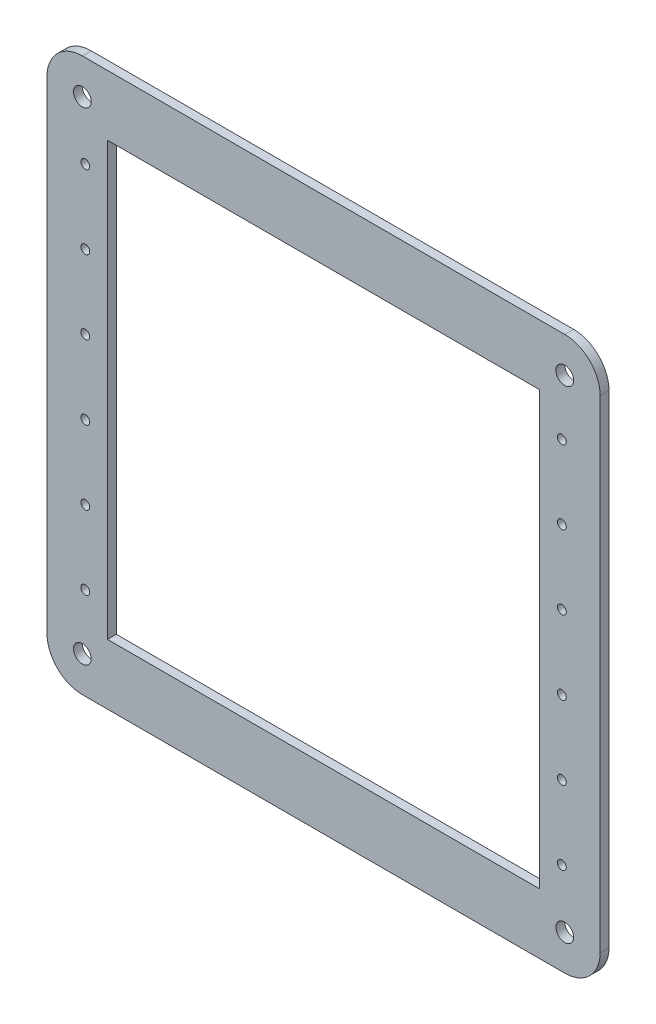
ISO-10303-21;
HEADER;
FILE_DESCRIPTION(('STEP AP214'),'2;1');
FILE_NAME('part.step','',(''),(''),'','','');
FILE_SCHEMA(('AUTOMOTIVE_DESIGN { 1 0 10303 214 1 1 1 1 }'));
ENDSEC;
DATA;
#1=APPLICATION_CONTEXT('core data for automotive mechanical design processes');
#2=APPLICATION_PROTOCOL_DEFINITION('international standard','automotive_design',2000,#1);
#3=PRODUCT_CONTEXT('',#1,'mechanical');
#4=PRODUCT('Part','Part','',(#3));
#5=PRODUCT_RELATED_PRODUCT_CATEGORY('part','',(#4));
#6=PRODUCT_DEFINITION_FORMATION('','',#4);
#7=PRODUCT_DEFINITION_CONTEXT('part definition',#1,'design');
#8=PRODUCT_DEFINITION('design','',#6,#7);
#9=PRODUCT_DEFINITION_SHAPE('','',#8);
#10=(LENGTH_UNIT() NAMED_UNIT(*) SI_UNIT(.MILLI.,.METRE.));
#11=(NAMED_UNIT(*) PLANE_ANGLE_UNIT() SI_UNIT($,.RADIAN.));
#12=(NAMED_UNIT(*) SI_UNIT($,.STERADIAN.) SOLID_ANGLE_UNIT());
#13=UNCERTAINTY_MEASURE_WITH_UNIT(LENGTH_MEASURE(1.E-05),#10,'distance_accuracy_value','');
#14=(GEOMETRIC_REPRESENTATION_CONTEXT(3) GLOBAL_UNCERTAINTY_ASSIGNED_CONTEXT((#13)) GLOBAL_UNIT_ASSIGNED_CONTEXT((#10,
#11,#12)) REPRESENTATION_CONTEXT('',''));
#15=CARTESIAN_POINT('',(0.,0.,0.));
#16=DIRECTION('',(0.,0.,1.));
#17=DIRECTION('',(1.,0.,0.));
#18=AXIS2_PLACEMENT_3D('',#15,#16,#17);
#19=CARTESIAN_POINT('',(-109.,-109.,4.));
#20=DIRECTION('',(0.,0.,1.));
#21=DIRECTION('',(1.,0.,0.));
#22=AXIS2_PLACEMENT_3D('',#19,#20,#21);
#23=PLANE('',#22);
#24=CARTESIAN_POINT('',(107.686291501015,-16.7000000000003,4.));
#25=DIRECTION('',(0.,0.,1.));
#26=DIRECTION('',(1.,0.,0.));
#27=AXIS2_PLACEMENT_3D('',#24,#25,#26);
#28=CIRCLE('',#27,2.);
#29=CARTESIAN_POINT('',(109.686291501015,-16.7000000000003,4.));
#30=VERTEX_POINT('',#29);
#31=EDGE_CURVE('E612',#30,#30,#28,.T.);
#32=ORIENTED_EDGE('',*,*,#31,.F.);
#33=EDGE_LOOP('',(#32));
#34=FACE_BOUND('',#33,.T.);
#35=CARTESIAN_POINT('',(107.686291501015,-50.0000000000003,4.));
#36=DIRECTION('',(0.,0.,1.));
#37=DIRECTION('',(1.,0.,0.));
#38=AXIS2_PLACEMENT_3D('',#35,#36,#37);
#39=CIRCLE('',#38,2.);
#40=CARTESIAN_POINT('',(109.686291501015,-50.0000000000003,4.));
#41=VERTEX_POINT('',#40);
#42=EDGE_CURVE('E613',#41,#41,#39,.T.);
#43=ORIENTED_EDGE('',*,*,#42,.F.);
#44=EDGE_LOOP('',(#43));
#45=FACE_BOUND('',#44,.T.);
#46=CARTESIAN_POINT('',(107.686291501015,-83.3000000000003,4.));
#47=DIRECTION('',(0.,0.,1.));
#48=DIRECTION('',(1.,0.,0.));
#49=AXIS2_PLACEMENT_3D('',#46,#47,#48);
#50=CIRCLE('',#49,2.00000000000001);
#51=CARTESIAN_POINT('',(109.686291501015,-83.3000000000003,4.));
#52=VERTEX_POINT('',#51);
#53=EDGE_CURVE('E617',#52,#52,#50,.T.);
#54=ORIENTED_EDGE('',*,*,#53,.F.);
#55=EDGE_LOOP('',(#54));
#56=FACE_BOUND('',#55,.T.);
#57=CARTESIAN_POINT('',(-107.686291501015,-83.3000000000003,4.));
#58=DIRECTION('',(0.,0.,1.));
#59=DIRECTION('',(1.,0.,0.));
#60=AXIS2_PLACEMENT_3D('',#57,#58,#59);
#61=CIRCLE('',#60,2.);
#62=CARTESIAN_POINT('',(-105.686291501015,-83.3000000000003,4.));
#63=VERTEX_POINT('',#62);
#64=EDGE_CURVE('E635',#63,#63,#61,.T.);
#65=ORIENTED_EDGE('',*,*,#64,.F.);
#66=EDGE_LOOP('',(#65));
#67=FACE_BOUND('',#66,.T.);
#68=CARTESIAN_POINT('',(-107.686291501015,-50.0000000000003,4.));
#69=DIRECTION('',(0.,0.,1.));
#70=DIRECTION('',(1.,0.,0.));
#71=AXIS2_PLACEMENT_3D('',#68,#69,#70);
#72=CIRCLE('',#71,2.00000000000001);
#73=CARTESIAN_POINT('',(-105.686291501015,-50.0000000000003,4.));
#74=VERTEX_POINT('',#73);
#75=EDGE_CURVE('E633',#74,#74,#72,.T.);
#76=ORIENTED_EDGE('',*,*,#75,.F.);
#77=EDGE_LOOP('',(#76));
#78=FACE_BOUND('',#77,.T.);
#79=CARTESIAN_POINT('',(-107.686291501015,-16.7000000000003,4.));
#80=DIRECTION('',(0.,0.,1.));
#81=DIRECTION('',(1.,0.,0.));
#82=AXIS2_PLACEMENT_3D('',#79,#80,#81);
#83=CIRCLE('',#82,2.);
#84=CARTESIAN_POINT('',(-105.686291501015,-16.7000000000003,4.));
#85=VERTEX_POINT('',#84);
#86=EDGE_CURVE('E630',#85,#85,#83,.T.);
#87=ORIENTED_EDGE('',*,*,#86,.F.);
#88=EDGE_LOOP('',(#87));
#89=FACE_BOUND('',#88,.T.);
#90=CARTESIAN_POINT('',(-107.686291501015,16.7000000000004,4.));
#91=DIRECTION('',(0.,0.,1.));
#92=DIRECTION('',(1.,0.,0.));
#93=AXIS2_PLACEMENT_3D('',#90,#91,#92);
#94=CIRCLE('',#93,2.00000000000001);
#95=CARTESIAN_POINT('',(-105.686291501015,16.7000000000004,4.));
#96=VERTEX_POINT('',#95);
#97=EDGE_CURVE('E627',#96,#96,#94,.T.);
#98=ORIENTED_EDGE('',*,*,#97,.F.);
#99=EDGE_LOOP('',(#98));
#100=FACE_BOUND('',#99,.T.);
#101=CARTESIAN_POINT('',(-107.686291501015,50.0000000000004,4.));
#102=DIRECTION('',(0.,0.,1.));
#103=DIRECTION('',(1.,0.,0.));
#104=AXIS2_PLACEMENT_3D('',#101,#102,#103);
#105=CIRCLE('',#104,2.);
#106=CARTESIAN_POINT('',(-105.686291501015,50.0000000000004,4.));
#107=VERTEX_POINT('',#106);
#108=EDGE_CURVE('E624',#107,#107,#105,.T.);
#109=ORIENTED_EDGE('',*,*,#108,.F.);
#110=EDGE_LOOP('',(#109));
#111=FACE_BOUND('',#110,.T.);
#112=CARTESIAN_POINT('',(107.686291501015,16.7000000000004,4.));
#113=DIRECTION('',(0.,0.,1.));
#114=DIRECTION('',(1.,0.,0.));
#115=AXIS2_PLACEMENT_3D('',#112,#113,#114);
#116=CIRCLE('',#115,2.);
#117=CARTESIAN_POINT('',(109.686291501015,16.7000000000004,4.));
#118=VERTEX_POINT('',#117);
#119=EDGE_CURVE('E614',#118,#118,#116,.T.);
#120=ORIENTED_EDGE('',*,*,#119,.F.);
#121=EDGE_LOOP('',(#120));
#122=FACE_BOUND('',#121,.T.);
#123=CARTESIAN_POINT('',(107.686291501015,50.0000000000004,4.));
#124=DIRECTION('',(0.,0.,1.));
#125=DIRECTION('',(1.,0.,0.));
#126=AXIS2_PLACEMENT_3D('',#123,#124,#125);
#127=CIRCLE('',#126,2.00000000000001);
#128=CARTESIAN_POINT('',(109.686291501015,50.0000000000004,4.));
#129=VERTEX_POINT('',#128);
#130=EDGE_CURVE('E620',#129,#129,#127,.T.);
#131=ORIENTED_EDGE('',*,*,#130,.F.);
#132=EDGE_LOOP('',(#131));
#133=FACE_BOUND('',#132,.T.);
#134=CARTESIAN_POINT('',(107.686291501015,83.3000000000004,4.));
#135=DIRECTION('',(0.,0.,1.));
#136=DIRECTION('',(1.,0.,0.));
#137=AXIS2_PLACEMENT_3D('',#134,#135,#136);
#138=CIRCLE('',#137,2.);
#139=CARTESIAN_POINT('',(109.686291501015,83.3000000000004,4.));
#140=VERTEX_POINT('',#139);
#141=EDGE_CURVE('E648',#140,#140,#138,.T.);
#142=ORIENTED_EDGE('',*,*,#141,.F.);
#143=EDGE_LOOP('',(#142));
#144=FACE_BOUND('',#143,.T.);
#145=CARTESIAN_POINT('',(-107.686291501015,83.3000000000004,4.));
#146=DIRECTION('',(0.,0.,1.));
#147=DIRECTION('',(1.,0.,0.));
#148=AXIS2_PLACEMENT_3D('',#145,#146,#147);
#149=CIRCLE('',#148,2.00000000000001);
#150=CARTESIAN_POINT('',(-105.686291501015,83.3000000000004,4.));
#151=VERTEX_POINT('',#150);
#152=EDGE_CURVE('E220',#151,#151,#149,.T.);
#153=ORIENTED_EDGE('',*,*,#152,.F.);
#154=EDGE_LOOP('',(#153));
#155=FACE_BOUND('',#154,.T.);
#156=CARTESIAN_POINT('',(109.,-109.,4.));
#157=DIRECTION('',(0.,0.,1.));
#158=DIRECTION('',(1.,0.,0.));
#159=AXIS2_PLACEMENT_3D('',#156,#157,#158);
#160=CIRCLE('',#159,4.00000000000001);
#161=CARTESIAN_POINT('',(113.,-109.,4.));
#162=VERTEX_POINT('',#161);
#163=EDGE_CURVE('E264',#162,#162,#160,.T.);
#164=ORIENTED_EDGE('',*,*,#163,.F.);
#165=EDGE_LOOP('',(#164));
#166=FACE_BOUND('',#165,.T.);
#167=CARTESIAN_POINT('',(-109.,109.,4.));
#168=DIRECTION('',(0.,0.,1.));
#169=DIRECTION('',(1.,0.,0.));
#170=AXIS2_PLACEMENT_3D('',#167,#168,#169);
#171=CIRCLE('',#170,4.00000000000001);
#172=CARTESIAN_POINT('',(-105.,109.,4.));
#173=VERTEX_POINT('',#172);
#174=EDGE_CURVE('E153',#173,#173,#171,.T.);
#175=ORIENTED_EDGE('',*,*,#174,.F.);
#176=EDGE_LOOP('',(#175));
#177=FACE_BOUND('',#176,.T.);
#178=CARTESIAN_POINT('',(-109.,-109.,4.));
#179=DIRECTION('',(0.,0.,1.));
#180=DIRECTION('',(1.,0.,0.));
#181=AXIS2_PLACEMENT_3D('',#178,#179,#180);
#182=CIRCLE('',#181,16.);
#183=CARTESIAN_POINT('',(-125.,-109.,4.));
#184=VERTEX_POINT('',#183);
#185=CARTESIAN_POINT('',(-109.,-125.,4.));
#186=VERTEX_POINT('',#185);
#187=EDGE_CURVE('E163',#184,#186,#182,.T.);
#188=ORIENTED_EDGE('',*,*,#187,.T.);
#189=DIRECTION('',(1.,0.,0.));
#190=VECTOR('',#189,1.);
#191=CARTESIAN_POINT('',(-109.,-125.,4.));
#192=LINE('',#191,#190);
#193=CARTESIAN_POINT('',(109.,-125.,4.));
#194=VERTEX_POINT('',#193);
#195=EDGE_CURVE('E166',#186,#194,#192,.T.);
#196=ORIENTED_EDGE('',*,*,#195,.T.);
#197=CARTESIAN_POINT('',(109.,-109.,4.));
#198=DIRECTION('',(0.,0.,1.));
#199=DIRECTION('',(1.,0.,0.));
#200=AXIS2_PLACEMENT_3D('',#197,#198,#199);
#201=CIRCLE('',#200,16.);
#202=CARTESIAN_POINT('',(125.,-109.,4.));
#203=VERTEX_POINT('',#202);
#204=EDGE_CURVE('E169',#194,#203,#201,.T.);
#205=ORIENTED_EDGE('',*,*,#204,.T.);
#206=DIRECTION('',(0.,1.,0.));
#207=VECTOR('',#206,1.);
#208=CARTESIAN_POINT('',(125.,109.,4.));
#209=LINE('',#208,#207);
#210=CARTESIAN_POINT('',(125.,109.,4.));
#211=VERTEX_POINT('',#210);
#212=EDGE_CURVE('E171',#203,#211,#209,.T.);
#213=ORIENTED_EDGE('',*,*,#212,.T.);
#214=CARTESIAN_POINT('',(109.,109.,4.));
#215=DIRECTION('',(0.,0.,1.));
#216=DIRECTION('',(-1.,0.,0.));
#217=AXIS2_PLACEMENT_3D('',#214,#215,#216);
#218=CIRCLE('',#217,16.);
#219=CARTESIAN_POINT('',(109.,125.,4.));
#220=VERTEX_POINT('',#219);
#221=EDGE_CURVE('E173',#211,#220,#218,.T.);
#222=ORIENTED_EDGE('',*,*,#221,.T.);
#223=DIRECTION('',(-1.,0.,0.));
#224=VECTOR('',#223,1.);
#225=CARTESIAN_POINT('',(-109.,125.,4.));
#226=LINE('',#225,#224);
#227=CARTESIAN_POINT('',(-109.,125.,4.));
#228=VERTEX_POINT('',#227);
#229=EDGE_CURVE('E175',#220,#228,#226,.T.);
#230=ORIENTED_EDGE('',*,*,#229,.T.);
#231=CARTESIAN_POINT('',(-109.,109.,4.));
#232=DIRECTION('',(0.,0.,1.));
#233=DIRECTION('',(1.,0.,0.));
#234=AXIS2_PLACEMENT_3D('',#231,#232,#233);
#235=CIRCLE('',#234,16.);
#236=CARTESIAN_POINT('',(-125.,109.,4.));
#237=VERTEX_POINT('',#236);
#238=EDGE_CURVE('E177',#228,#237,#235,.T.);
#239=ORIENTED_EDGE('',*,*,#238,.T.);
#240=DIRECTION('',(0.,-1.,0.));
#241=VECTOR('',#240,1.);
#242=CARTESIAN_POINT('',(-125.,109.,4.));
#243=LINE('',#242,#241);
#244=EDGE_CURVE('E179',#237,#184,#243,.T.);
#245=ORIENTED_EDGE('',*,*,#244,.T.);
#246=EDGE_LOOP('',(#188,#196,#205,#213,#222,#230,#239,#245));
#247=FACE_BOUND('',#246,.T.);
#248=DIRECTION('',(1.,0.,0.));
#249=VECTOR('',#248,1.);
#250=CARTESIAN_POINT('',(97.6862915010152,-97.6862915010152,4.));
#251=LINE('',#250,#249);
#252=CARTESIAN_POINT('',(-97.6862915010153,-97.6862915010152,4.));
#253=VERTEX_POINT('',#252);
#254=CARTESIAN_POINT('',(97.6862915010152,-97.6862915010152,4.));
#255=VERTEX_POINT('',#254);
#256=EDGE_CURVE('E132',#253,#255,#251,.T.);
#257=ORIENTED_EDGE('',*,*,#256,.F.);
#258=DIRECTION('',(0.,-1.,0.));
#259=VECTOR('',#258,1.);
#260=CARTESIAN_POINT('',(-97.6862915010153,-97.6862915010152,4.));
#261=LINE('',#260,#259);
#262=CARTESIAN_POINT('',(-97.6862915010153,97.6862915010152,4.));
#263=VERTEX_POINT('',#262);
#264=EDGE_CURVE('E124',#263,#253,#261,.T.);
#265=ORIENTED_EDGE('',*,*,#264,.F.);
#266=DIRECTION('',(-1.,0.,0.));
#267=VECTOR('',#266,1.);
#268=CARTESIAN_POINT('',(-97.6862915010153,97.6862915010152,4.));
#269=LINE('',#268,#267);
#270=CARTESIAN_POINT('',(97.6862915010152,97.6862915010152,4.));
#271=VERTEX_POINT('',#270);
#272=EDGE_CURVE('E147',#271,#263,#269,.T.);
#273=ORIENTED_EDGE('',*,*,#272,.F.);
#274=DIRECTION('',(0.,1.,0.));
#275=VECTOR('',#274,1.);
#276=CARTESIAN_POINT('',(97.6862915010152,97.6862915010152,4.));
#277=LINE('',#276,#275);
#278=EDGE_CURVE('E145',#255,#271,#277,.T.);
#279=ORIENTED_EDGE('',*,*,#278,.F.);
#280=EDGE_LOOP('',(#257,#265,#273,#279));
#281=FACE_BOUND('',#280,.T.);
#282=CARTESIAN_POINT('',(109.,109.,4.));
#283=DIRECTION('',(0.,0.,1.));
#284=DIRECTION('',(1.,0.,0.));
#285=AXIS2_PLACEMENT_3D('',#282,#283,#284);
#286=CIRCLE('',#285,4.00000000000001);
#287=CARTESIAN_POINT('',(113.,109.,4.));
#288=VERTEX_POINT('',#287);
#289=EDGE_CURVE('E270',#288,#288,#286,.T.);
#290=ORIENTED_EDGE('',*,*,#289,.F.);
#291=EDGE_LOOP('',(#290));
#292=FACE_BOUND('',#291,.T.);
#293=CARTESIAN_POINT('',(-109.,-109.,4.));
#294=DIRECTION('',(0.,0.,1.));
#295=DIRECTION('',(1.,0.,0.));
#296=AXIS2_PLACEMENT_3D('',#293,#294,#295);
#297=CIRCLE('',#296,4.00000000000001);
#298=CARTESIAN_POINT('',(-105.,-109.,4.));
#299=VERTEX_POINT('',#298);
#300=EDGE_CURVE('E255',#299,#299,#297,.T.);
#301=ORIENTED_EDGE('',*,*,#300,.F.);
#302=EDGE_LOOP('',(#301));
#303=FACE_BOUND('',#302,.T.);
#304=ADVANCED_FACE('F33',(#34,#45,#56,#67,#78,#89,#100,#111,#122,#133,#144,#155,#166,#177,#247,
#281,#292,#303),#23,.T.);
#305=CARTESIAN_POINT('',(-109.,-109.,0.));
#306=DIRECTION('',(0.,0.,1.));
#307=DIRECTION('',(1.,0.,0.));
#308=AXIS2_PLACEMENT_3D('',#305,#306,#307);
#309=PLANE('',#308);
#310=CARTESIAN_POINT('',(107.686291501015,-16.7000000000003,0.));
#311=DIRECTION('',(0.,0.,1.));
#312=DIRECTION('',(1.,0.,0.));
#313=AXIS2_PLACEMENT_3D('',#310,#311,#312);
#314=CIRCLE('',#313,2.);
#315=CARTESIAN_POINT('',(109.686291501015,-16.7000000000003,0.));
#316=VERTEX_POINT('',#315);
#317=EDGE_CURVE('E37',#316,#316,#314,.T.);
#318=ORIENTED_EDGE('',*,*,#317,.T.);
#319=EDGE_LOOP('',(#318));
#320=FACE_BOUND('',#319,.T.);
#321=CARTESIAN_POINT('',(107.686291501015,-50.0000000000003,0.));
#322=DIRECTION('',(0.,0.,1.));
#323=DIRECTION('',(1.,0.,0.));
#324=AXIS2_PLACEMENT_3D('',#321,#322,#323);
#325=CIRCLE('',#324,2.);
#326=CARTESIAN_POINT('',(109.686291501015,-50.0000000000003,0.));
#327=VERTEX_POINT('',#326);
#328=EDGE_CURVE('E246',#327,#327,#325,.T.);
#329=ORIENTED_EDGE('',*,*,#328,.T.);
#330=EDGE_LOOP('',(#329));
#331=FACE_BOUND('',#330,.T.);
#332=CARTESIAN_POINT('',(107.686291501015,-83.3000000000003,0.));
#333=DIRECTION('',(0.,0.,1.));
#334=DIRECTION('',(1.,0.,0.));
#335=AXIS2_PLACEMENT_3D('',#332,#333,#334);
#336=CIRCLE('',#335,2.00000000000001);
#337=CARTESIAN_POINT('',(109.686291501015,-83.3000000000003,0.));
#338=VERTEX_POINT('',#337);
#339=EDGE_CURVE('E244',#338,#338,#336,.T.);
#340=ORIENTED_EDGE('',*,*,#339,.T.);
#341=EDGE_LOOP('',(#340));
#342=FACE_BOUND('',#341,.T.);
#343=CARTESIAN_POINT('',(-107.686291501015,-83.3000000000003,0.));
#344=DIRECTION('',(0.,0.,1.));
#345=DIRECTION('',(1.,0.,0.));
#346=AXIS2_PLACEMENT_3D('',#343,#344,#345);
#347=CIRCLE('',#346,2.);
#348=CARTESIAN_POINT('',(-105.686291501015,-83.3000000000003,0.));
#349=VERTEX_POINT('',#348);
#350=EDGE_CURVE('E241',#349,#349,#347,.T.);
#351=ORIENTED_EDGE('',*,*,#350,.T.);
#352=EDGE_LOOP('',(#351));
#353=FACE_BOUND('',#352,.T.);
#354=CARTESIAN_POINT('',(-107.686291501015,-50.0000000000003,0.));
#355=DIRECTION('',(0.,0.,1.));
#356=DIRECTION('',(1.,0.,0.));
#357=AXIS2_PLACEMENT_3D('',#354,#355,#356);
#358=CIRCLE('',#357,2.00000000000001);
#359=CARTESIAN_POINT('',(-105.686291501015,-50.0000000000003,0.));
#360=VERTEX_POINT('',#359);
#361=EDGE_CURVE('E238',#360,#360,#358,.T.);
#362=ORIENTED_EDGE('',*,*,#361,.T.);
#363=EDGE_LOOP('',(#362));
#364=FACE_BOUND('',#363,.T.);
#365=CARTESIAN_POINT('',(-107.686291501015,-16.7000000000003,0.));
#366=DIRECTION('',(0.,0.,1.));
#367=DIRECTION('',(1.,0.,0.));
#368=AXIS2_PLACEMENT_3D('',#365,#366,#367);
#369=CIRCLE('',#368,2.);
#370=CARTESIAN_POINT('',(-105.686291501015,-16.7000000000003,0.));
#371=VERTEX_POINT('',#370);
#372=EDGE_CURVE('E235',#371,#371,#369,.T.);
#373=ORIENTED_EDGE('',*,*,#372,.T.);
#374=EDGE_LOOP('',(#373));
#375=FACE_BOUND('',#374,.T.);
#376=CARTESIAN_POINT('',(-107.686291501015,16.7000000000004,0.));
#377=DIRECTION('',(0.,0.,1.));
#378=DIRECTION('',(1.,0.,0.));
#379=AXIS2_PLACEMENT_3D('',#376,#377,#378);
#380=CIRCLE('',#379,2.00000000000001);
#381=CARTESIAN_POINT('',(-105.686291501015,16.7000000000004,0.));
#382=VERTEX_POINT('',#381);
#383=EDGE_CURVE('E232',#382,#382,#380,.T.);
#384=ORIENTED_EDGE('',*,*,#383,.T.);
#385=EDGE_LOOP('',(#384));
#386=FACE_BOUND('',#385,.T.);
#387=CARTESIAN_POINT('',(-107.686291501015,50.0000000000004,0.));
#388=DIRECTION('',(0.,0.,1.));
#389=DIRECTION('',(1.,0.,0.));
#390=AXIS2_PLACEMENT_3D('',#387,#388,#389);
#391=CIRCLE('',#390,2.);
#392=CARTESIAN_POINT('',(-105.686291501015,50.0000000000004,0.));
#393=VERTEX_POINT('',#392);
#394=EDGE_CURVE('E229',#393,#393,#391,.T.);
#395=ORIENTED_EDGE('',*,*,#394,.T.);
#396=EDGE_LOOP('',(#395));
#397=FACE_BOUND('',#396,.T.);
#398=CARTESIAN_POINT('',(107.686291501015,16.7000000000004,0.));
#399=DIRECTION('',(0.,0.,1.));
#400=DIRECTION('',(1.,0.,0.));
#401=AXIS2_PLACEMENT_3D('',#398,#399,#400);
#402=CIRCLE('',#401,2.);
#403=CARTESIAN_POINT('',(109.686291501015,16.7000000000004,0.));
#404=VERTEX_POINT('',#403);
#405=EDGE_CURVE('E226',#404,#404,#402,.T.);
#406=ORIENTED_EDGE('',*,*,#405,.T.);
#407=EDGE_LOOP('',(#406));
#408=FACE_BOUND('',#407,.T.);
#409=CARTESIAN_POINT('',(107.686291501015,50.0000000000004,0.));
#410=DIRECTION('',(0.,0.,1.));
#411=DIRECTION('',(1.,0.,0.));
#412=AXIS2_PLACEMENT_3D('',#409,#410,#411);
#413=CIRCLE('',#412,2.00000000000001);
#414=CARTESIAN_POINT('',(109.686291501015,50.0000000000004,0.));
#415=VERTEX_POINT('',#414);
#416=EDGE_CURVE('E223',#415,#415,#413,.T.);
#417=ORIENTED_EDGE('',*,*,#416,.T.);
#418=EDGE_LOOP('',(#417));
#419=FACE_BOUND('',#418,.T.);
#420=CARTESIAN_POINT('',(107.686291501015,83.3000000000004,0.));
#421=DIRECTION('',(0.,0.,1.));
#422=DIRECTION('',(1.,0.,0.));
#423=AXIS2_PLACEMENT_3D('',#420,#421,#422);
#424=CIRCLE('',#423,2.);
#425=CARTESIAN_POINT('',(109.686291501015,83.3000000000004,0.));
#426=VERTEX_POINT('',#425);
#427=EDGE_CURVE('E219',#426,#426,#424,.T.);
#428=ORIENTED_EDGE('',*,*,#427,.T.);
#429=EDGE_LOOP('',(#428));
#430=FACE_BOUND('',#429,.T.);
#431=CARTESIAN_POINT('',(-107.686291501015,83.3000000000004,0.));
#432=DIRECTION('',(0.,0.,1.));
#433=DIRECTION('',(1.,0.,0.));
#434=AXIS2_PLACEMENT_3D('',#431,#432,#433);
#435=CIRCLE('',#434,2.00000000000001);
#436=CARTESIAN_POINT('',(-105.686291501015,83.3000000000004,0.));
#437=VERTEX_POINT('',#436);
#438=EDGE_CURVE('E216',#437,#437,#435,.T.);
#439=ORIENTED_EDGE('',*,*,#438,.T.);
#440=EDGE_LOOP('',(#439));
#441=FACE_BOUND('',#440,.T.);
#442=CARTESIAN_POINT('',(-109.,-109.,0.));
#443=DIRECTION('',(0.,0.,1.));
#444=DIRECTION('',(1.,0.,0.));
#445=AXIS2_PLACEMENT_3D('',#442,#443,#444);
#446=CIRCLE('',#445,16.);
#447=CARTESIAN_POINT('',(-125.,-109.,0.));
#448=VERTEX_POINT('',#447);
#449=CARTESIAN_POINT('',(-109.,-125.,0.));
#450=VERTEX_POINT('',#449);
#451=EDGE_CURVE('E140',#448,#450,#446,.T.);
#452=ORIENTED_EDGE('',*,*,#451,.F.);
#453=DIRECTION('',(0.,-1.,0.));
#454=VECTOR('',#453,1.);
#455=CARTESIAN_POINT('',(-125.,109.,0.));
#456=LINE('',#455,#454);
#457=CARTESIAN_POINT('',(-125.,109.,0.));
#458=VERTEX_POINT('',#457);
#459=EDGE_CURVE('E167',#458,#448,#456,.T.);
#460=ORIENTED_EDGE('',*,*,#459,.F.);
#461=CARTESIAN_POINT('',(-109.,109.,0.));
#462=DIRECTION('',(0.,0.,1.));
#463=DIRECTION('',(1.,0.,0.));
#464=AXIS2_PLACEMENT_3D('',#461,#462,#463);
#465=CIRCLE('',#464,16.);
#466=CARTESIAN_POINT('',(-109.,125.,0.));
#467=VERTEX_POINT('',#466);
#468=EDGE_CURVE('E194',#467,#458,#465,.T.);
#469=ORIENTED_EDGE('',*,*,#468,.F.);
#470=DIRECTION('',(-1.,0.,0.));
#471=VECTOR('',#470,1.);
#472=CARTESIAN_POINT('',(-109.,125.,0.));
#473=LINE('',#472,#471);
#474=CARTESIAN_POINT('',(109.,125.,0.));
#475=VERTEX_POINT('',#474);
#476=EDGE_CURVE('E192',#475,#467,#473,.T.);
#477=ORIENTED_EDGE('',*,*,#476,.F.);
#478=CARTESIAN_POINT('',(109.,109.,0.));
#479=DIRECTION('',(0.,0.,1.));
#480=DIRECTION('',(-1.,0.,0.));
#481=AXIS2_PLACEMENT_3D('',#478,#479,#480);
#482=CIRCLE('',#481,16.);
#483=CARTESIAN_POINT('',(125.,109.,0.));
#484=VERTEX_POINT('',#483);
#485=EDGE_CURVE('E190',#484,#475,#482,.T.);
#486=ORIENTED_EDGE('',*,*,#485,.F.);
#487=DIRECTION('',(0.,1.,0.));
#488=VECTOR('',#487,1.);
#489=CARTESIAN_POINT('',(125.,109.,0.));
#490=LINE('',#489,#488);
#491=CARTESIAN_POINT('',(125.,-109.,0.));
#492=VERTEX_POINT('',#491);
#493=EDGE_CURVE('E188',#492,#484,#490,.T.);
#494=ORIENTED_EDGE('',*,*,#493,.F.);
#495=CARTESIAN_POINT('',(109.,-109.,0.));
#496=DIRECTION('',(0.,0.,1.));
#497=DIRECTION('',(1.,0.,0.));
#498=AXIS2_PLACEMENT_3D('',#495,#496,#497);
#499=CIRCLE('',#498,16.);
#500=CARTESIAN_POINT('',(109.,-125.,0.));
#501=VERTEX_POINT('',#500);
#502=EDGE_CURVE('E186',#501,#492,#499,.T.);
#503=ORIENTED_EDGE('',*,*,#502,.F.);
#504=DIRECTION('',(1.,0.,0.));
#505=VECTOR('',#504,1.);
#506=CARTESIAN_POINT('',(-109.,-125.,0.));
#507=LINE('',#506,#505);
#508=EDGE_CURVE('E184',#450,#501,#507,.T.);
#509=ORIENTED_EDGE('',*,*,#508,.F.);
#510=EDGE_LOOP('',(#452,#460,#469,#477,#486,#494,#503,#509));
#511=FACE_BOUND('',#510,.T.);
#512=DIRECTION('',(0.,-1.,0.));
#513=VECTOR('',#512,1.);
#514=CARTESIAN_POINT('',(-97.6862915010153,-97.6862915010152,0.));
#515=LINE('',#514,#513);
#516=CARTESIAN_POINT('',(-97.6862915010153,97.6862915010152,0.));
#517=VERTEX_POINT('',#516);
#518=CARTESIAN_POINT('',(-97.6862915010153,-97.6862915010152,0.));
#519=VERTEX_POINT('',#518);
#520=EDGE_CURVE('E58',#517,#519,#515,.T.);
#521=ORIENTED_EDGE('',*,*,#520,.T.);
#522=DIRECTION('',(1.,0.,0.));
#523=VECTOR('',#522,1.);
#524=CARTESIAN_POINT('',(97.6862915010152,-97.6862915010152,0.));
#525=LINE('',#524,#523);
#526=CARTESIAN_POINT('',(97.6862915010152,-97.6862915010152,0.));
#527=VERTEX_POINT('',#526);
#528=EDGE_CURVE('E139',#519,#527,#525,.T.);
#529=ORIENTED_EDGE('',*,*,#528,.T.);
#530=DIRECTION('',(0.,1.,0.));
#531=VECTOR('',#530,1.);
#532=CARTESIAN_POINT('',(97.6862915010152,97.6862915010152,0.));
#533=LINE('',#532,#531);
#534=CARTESIAN_POINT('',(97.6862915010152,97.6862915010152,0.));
#535=VERTEX_POINT('',#534);
#536=EDGE_CURVE('E155',#527,#535,#533,.T.);
#537=ORIENTED_EDGE('',*,*,#536,.T.);
#538=DIRECTION('',(-1.,0.,0.));
#539=VECTOR('',#538,1.);
#540=CARTESIAN_POINT('',(-97.6862915010153,97.6862915010152,0.));
#541=LINE('',#540,#539);
#542=EDGE_CURVE('E133',#535,#517,#541,.T.);
#543=ORIENTED_EDGE('',*,*,#542,.T.);
#544=EDGE_LOOP('',(#521,#529,#537,#543));
#545=FACE_BOUND('',#544,.T.);
#546=CARTESIAN_POINT('',(-109.,109.,0.));
#547=DIRECTION('',(0.,0.,1.));
#548=DIRECTION('',(1.,0.,0.));
#549=AXIS2_PLACEMENT_3D('',#546,#547,#548);
#550=CIRCLE('',#549,4.00000000000001);
#551=CARTESIAN_POINT('',(-105.,109.,0.));
#552=VERTEX_POINT('',#551);
#553=EDGE_CURVE('E273',#552,#552,#550,.T.);
#554=ORIENTED_EDGE('',*,*,#553,.T.);
#555=EDGE_LOOP('',(#554));
#556=FACE_BOUND('',#555,.T.);
#557=CARTESIAN_POINT('',(109.,109.,0.));
#558=DIRECTION('',(0.,0.,1.));
#559=DIRECTION('',(1.,0.,0.));
#560=AXIS2_PLACEMENT_3D('',#557,#558,#559);
#561=CIRCLE('',#560,4.00000000000001);
#562=CARTESIAN_POINT('',(113.,109.,0.));
#563=VERTEX_POINT('',#562);
#564=EDGE_CURVE('E267',#563,#563,#561,.T.);
#565=ORIENTED_EDGE('',*,*,#564,.T.);
#566=EDGE_LOOP('',(#565));
#567=FACE_BOUND('',#566,.T.);
#568=CARTESIAN_POINT('',(109.,-109.,0.));
#569=DIRECTION('',(0.,0.,1.));
#570=DIRECTION('',(1.,0.,0.));
#571=AXIS2_PLACEMENT_3D('',#568,#569,#570);
#572=CIRCLE('',#571,4.00000000000001);
#573=CARTESIAN_POINT('',(113.,-109.,0.));
#574=VERTEX_POINT('',#573);
#575=EDGE_CURVE('E260',#574,#574,#572,.T.);
#576=ORIENTED_EDGE('',*,*,#575,.T.);
#577=EDGE_LOOP('',(#576));
#578=FACE_BOUND('',#577,.T.);
#579=CARTESIAN_POINT('',(-109.,-109.,0.));
#580=DIRECTION('',(0.,0.,1.));
#581=DIRECTION('',(1.,0.,0.));
#582=AXIS2_PLACEMENT_3D('',#579,#580,#581);
#583=CIRCLE('',#582,4.00000000000001);
#584=CARTESIAN_POINT('',(-105.,-109.,0.));
#585=VERTEX_POINT('',#584);
#586=EDGE_CURVE('E251',#585,#585,#583,.T.);
#587=ORIENTED_EDGE('',*,*,#586,.T.);
#588=EDGE_LOOP('',(#587));
#589=FACE_BOUND('',#588,.T.);
#590=ADVANCED_FACE('F280',(#320,#331,#342,#353,#364,#375,#386,#397,#408,#419,#430,#441,#511,
#545,#556,#567,#578,#589),#309,.F.);
#591=CARTESIAN_POINT('',(-109.,-109.,4.));
#592=DIRECTION('',(0.,0.,-1.));
#593=DIRECTION('',(-1.,0.,0.));
#594=AXIS2_PLACEMENT_3D('',#591,#592,#593);
#595=CYLINDRICAL_SURFACE('',#594,16.);
#596=ORIENTED_EDGE('',*,*,#451,.T.);
#597=DIRECTION('',(0.,0.,-1.));
#598=VECTOR('',#597,1.);
#599=CARTESIAN_POINT('',(-109.,-125.,4.));
#600=LINE('',#599,#598);
#601=EDGE_CURVE('E11',#186,#450,#600,.T.);
#602=ORIENTED_EDGE('',*,*,#601,.F.);
#603=ORIENTED_EDGE('',*,*,#187,.F.);
#604=DIRECTION('',(0.,0.,-1.));
#605=VECTOR('',#604,1.);
#606=CARTESIAN_POINT('',(-125.,-109.,4.));
#607=LINE('',#606,#605);
#608=EDGE_CURVE('E181',#184,#448,#607,.T.);
#609=ORIENTED_EDGE('',*,*,#608,.T.);
#610=EDGE_LOOP('',(#596,#602,#603,#609));
#611=FACE_BOUND('',#610,.T.);
#612=ADVANCED_FACE('F35',(#611),#595,.T.);
#613=CARTESIAN_POINT('',(-109.,-125.,4.));
#614=DIRECTION('',(0.,1.,0.));
#615=DIRECTION('',(0.,0.,1.));
#616=AXIS2_PLACEMENT_3D('',#613,#614,#615);
#617=PLANE('',#616);
#618=ORIENTED_EDGE('',*,*,#508,.T.);
#619=DIRECTION('',(0.,0.,-1.));
#620=VECTOR('',#619,1.);
#621=CARTESIAN_POINT('',(109.,-125.,4.));
#622=LINE('',#621,#620);
#623=EDGE_CURVE('E42',#194,#501,#622,.T.);
#624=ORIENTED_EDGE('',*,*,#623,.F.);
#625=ORIENTED_EDGE('',*,*,#195,.F.);
#626=ORIENTED_EDGE('',*,*,#601,.T.);
#627=EDGE_LOOP('',(#618,#624,#625,#626));
#628=FACE_BOUND('',#627,.T.);
#629=ADVANCED_FACE('F333',(#628),#617,.F.);
#630=CARTESIAN_POINT('',(109.,-109.,4.));
#631=DIRECTION('',(0.,0.,-1.));
#632=DIRECTION('',(-1.,0.,0.));
#633=AXIS2_PLACEMENT_3D('',#630,#631,#632);
#634=CYLINDRICAL_SURFACE('',#633,16.);
#635=ORIENTED_EDGE('',*,*,#502,.T.);
#636=DIRECTION('',(0.,0.,-1.));
#637=VECTOR('',#636,1.);
#638=CARTESIAN_POINT('',(125.,-109.,4.));
#639=LINE('',#638,#637);
#640=EDGE_CURVE('E211',#203,#492,#639,.T.);
#641=ORIENTED_EDGE('',*,*,#640,.F.);
#642=ORIENTED_EDGE('',*,*,#204,.F.);
#643=ORIENTED_EDGE('',*,*,#623,.T.);
#644=EDGE_LOOP('',(#635,#641,#642,#643));
#645=FACE_BOUND('',#644,.T.);
#646=ADVANCED_FACE('F330',(#645),#634,.T.);
#647=CARTESIAN_POINT('',(125.,109.,4.));
#648=DIRECTION('',(-1.,0.,0.));
#649=DIRECTION('',(0.,-1.,0.));
#650=AXIS2_PLACEMENT_3D('',#647,#648,#649);
#651=PLANE('',#650);
#652=ORIENTED_EDGE('',*,*,#493,.T.);
#653=DIRECTION('',(0.,0.,-1.));
#654=VECTOR('',#653,1.);
#655=CARTESIAN_POINT('',(125.,109.,4.));
#656=LINE('',#655,#654);
#657=EDGE_CURVE('E208',#211,#484,#656,.T.);
#658=ORIENTED_EDGE('',*,*,#657,.F.);
#659=ORIENTED_EDGE('',*,*,#212,.F.);
#660=ORIENTED_EDGE('',*,*,#640,.T.);
#661=EDGE_LOOP('',(#652,#658,#659,#660));
#662=FACE_BOUND('',#661,.T.);
#663=ADVANCED_FACE('F326',(#662),#651,.F.);
#664=CARTESIAN_POINT('',(109.,109.,4.));
#665=DIRECTION('',(0.,0.,-1.));
#666=DIRECTION('',(-1.,0.,0.));
#667=AXIS2_PLACEMENT_3D('',#664,#665,#666);
#668=CYLINDRICAL_SURFACE('',#667,16.);
#669=ORIENTED_EDGE('',*,*,#485,.T.);
#670=DIRECTION('',(0.,0.,-1.));
#671=VECTOR('',#670,1.);
#672=CARTESIAN_POINT('',(109.,125.,4.));
#673=LINE('',#672,#671);
#674=EDGE_CURVE('E205',#220,#475,#673,.T.);
#675=ORIENTED_EDGE('',*,*,#674,.F.);
#676=ORIENTED_EDGE('',*,*,#221,.F.);
#677=ORIENTED_EDGE('',*,*,#657,.T.);
#678=EDGE_LOOP('',(#669,#675,#676,#677));
#679=FACE_BOUND('',#678,.T.);
#680=ADVANCED_FACE('F322',(#679),#668,.T.);
#681=CARTESIAN_POINT('',(-109.,125.,4.));
#682=DIRECTION('',(0.,-1.,0.));
#683=DIRECTION('',(1.,0.,0.));
#684=AXIS2_PLACEMENT_3D('',#681,#682,#683);
#685=PLANE('',#684);
#686=ORIENTED_EDGE('',*,*,#476,.T.);
#687=DIRECTION('',(0.,0.,-1.));
#688=VECTOR('',#687,1.);
#689=CARTESIAN_POINT('',(-109.,125.,4.));
#690=LINE('',#689,#688);
#691=EDGE_CURVE('E202',#228,#467,#690,.T.);
#692=ORIENTED_EDGE('',*,*,#691,.F.);
#693=ORIENTED_EDGE('',*,*,#229,.F.);
#694=ORIENTED_EDGE('',*,*,#674,.T.);
#695=EDGE_LOOP('',(#686,#692,#693,#694));
#696=FACE_BOUND('',#695,.T.);
#697=ADVANCED_FACE('F318',(#696),#685,.F.);
#698=CARTESIAN_POINT('',(-109.,109.,4.));
#699=DIRECTION('',(0.,0.,-1.));
#700=DIRECTION('',(-1.,0.,0.));
#701=AXIS2_PLACEMENT_3D('',#698,#699,#700);
#702=CYLINDRICAL_SURFACE('',#701,16.);
#703=ORIENTED_EDGE('',*,*,#468,.T.);
#704=DIRECTION('',(0.,0.,-1.));
#705=VECTOR('',#704,1.);
#706=CARTESIAN_POINT('',(-125.,109.,4.));
#707=LINE('',#706,#705);
#708=EDGE_CURVE('E199',#237,#458,#707,.T.);
#709=ORIENTED_EDGE('',*,*,#708,.F.);
#710=ORIENTED_EDGE('',*,*,#238,.F.);
#711=ORIENTED_EDGE('',*,*,#691,.T.);
#712=EDGE_LOOP('',(#703,#709,#710,#711));
#713=FACE_BOUND('',#712,.T.);
#714=ADVANCED_FACE('F314',(#713),#702,.T.);
#715=CARTESIAN_POINT('',(-125.,109.,4.));
#716=DIRECTION('',(1.,0.,0.));
#717=DIRECTION('',(0.,0.,-1.));
#718=AXIS2_PLACEMENT_3D('',#715,#716,#717);
#719=PLANE('',#718);
#720=ORIENTED_EDGE('',*,*,#459,.T.);
#721=ORIENTED_EDGE('',*,*,#608,.F.);
#722=ORIENTED_EDGE('',*,*,#244,.F.);
#723=ORIENTED_EDGE('',*,*,#708,.T.);
#724=EDGE_LOOP('',(#720,#721,#722,#723));
#725=FACE_BOUND('',#724,.T.);
#726=ADVANCED_FACE('F311',(#725),#719,.F.);
#727=CARTESIAN_POINT('',(-97.6862915010153,-97.6862915010152,4.));
#728=DIRECTION('',(1.,0.,0.));
#729=DIRECTION('',(0.,0.,-1.));
#730=AXIS2_PLACEMENT_3D('',#727,#728,#729);
#731=PLANE('',#730);
#732=ORIENTED_EDGE('',*,*,#520,.F.);
#733=DIRECTION('',(0.,0.,-1.));
#734=VECTOR('',#733,1.);
#735=CARTESIAN_POINT('',(-97.6862915010153,97.6862915010152,4.));
#736=LINE('',#735,#734);
#737=EDGE_CURVE('E128',#263,#517,#736,.T.);
#738=ORIENTED_EDGE('',*,*,#737,.F.);
#739=ORIENTED_EDGE('',*,*,#264,.T.);
#740=DIRECTION('',(0.,0.,-1.));
#741=VECTOR('',#740,1.);
#742=CARTESIAN_POINT('',(-97.6862915010153,-97.6862915010152,4.));
#743=LINE('',#742,#741);
#744=EDGE_CURVE('E127',#253,#519,#743,.T.);
#745=ORIENTED_EDGE('',*,*,#744,.T.);
#746=EDGE_LOOP('',(#732,#738,#739,#745));
#747=FACE_BOUND('',#746,.T.);
#748=ADVANCED_FACE('F126',(#747),#731,.T.);
#749=CARTESIAN_POINT('',(97.6862915010152,-97.6862915010152,4.));
#750=DIRECTION('',(0.,1.,0.));
#751=DIRECTION('',(0.,0.,1.));
#752=AXIS2_PLACEMENT_3D('',#749,#750,#751);
#753=PLANE('',#752);
#754=ORIENTED_EDGE('',*,*,#528,.F.);
#755=ORIENTED_EDGE('',*,*,#744,.F.);
#756=ORIENTED_EDGE('',*,*,#256,.T.);
#757=DIRECTION('',(0.,0.,-1.));
#758=VECTOR('',#757,1.);
#759=CARTESIAN_POINT('',(97.6862915010152,-97.6862915010152,4.));
#760=LINE('',#759,#758);
#761=EDGE_CURVE('E141',#255,#527,#760,.T.);
#762=ORIENTED_EDGE('',*,*,#761,.T.);
#763=EDGE_LOOP('',(#754,#755,#756,#762));
#764=FACE_BOUND('',#763,.T.);
#765=ADVANCED_FACE('F136',(#764),#753,.T.);
#766=CARTESIAN_POINT('',(97.6862915010152,97.6862915010152,4.));
#767=DIRECTION('',(-1.,0.,0.));
#768=DIRECTION('',(0.,0.,1.));
#769=AXIS2_PLACEMENT_3D('',#766,#767,#768);
#770=PLANE('',#769);
#771=ORIENTED_EDGE('',*,*,#536,.F.);
#772=ORIENTED_EDGE('',*,*,#761,.F.);
#773=ORIENTED_EDGE('',*,*,#278,.T.);
#774=DIRECTION('',(0.,0.,-1.));
#775=VECTOR('',#774,1.);
#776=CARTESIAN_POINT('',(97.6862915010152,97.6862915010152,4.));
#777=LINE('',#776,#775);
#778=EDGE_CURVE('E50',#271,#535,#777,.T.);
#779=ORIENTED_EDGE('',*,*,#778,.T.);
#780=EDGE_LOOP('',(#771,#772,#773,#779));
#781=FACE_BOUND('',#780,.T.);
#782=ADVANCED_FACE('F296',(#781),#770,.T.);
#783=CARTESIAN_POINT('',(-97.6862915010153,97.6862915010152,4.));
#784=DIRECTION('',(0.,-1.,0.));
#785=DIRECTION('',(0.,0.,-1.));
#786=AXIS2_PLACEMENT_3D('',#783,#784,#785);
#787=PLANE('',#786);
#788=ORIENTED_EDGE('',*,*,#542,.F.);
#789=ORIENTED_EDGE('',*,*,#778,.F.);
#790=ORIENTED_EDGE('',*,*,#272,.T.);
#791=ORIENTED_EDGE('',*,*,#737,.T.);
#792=EDGE_LOOP('',(#788,#789,#790,#791));
#793=FACE_BOUND('',#792,.T.);
#794=ADVANCED_FACE('F286',(#793),#787,.T.);
#795=CARTESIAN_POINT('',(-109.,109.,4.));
#796=DIRECTION('',(0.,0.,-1.));
#797=DIRECTION('',(-1.,0.,0.));
#798=AXIS2_PLACEMENT_3D('',#795,#796,#797);
#799=CYLINDRICAL_SURFACE('',#798,4.00000000000001);
#800=ORIENTED_EDGE('',*,*,#174,.T.);
#801=EDGE_LOOP('',(#800));
#802=FACE_BOUND('',#801,.T.);
#803=ORIENTED_EDGE('',*,*,#553,.F.);
#804=EDGE_LOOP('',(#803));
#805=FACE_BOUND('',#804,.T.);
#806=ADVANCED_FACE('F283',(#802,#805),#799,.F.);
#807=CARTESIAN_POINT('',(109.,109.,4.));
#808=DIRECTION('',(0.,0.,-1.));
#809=DIRECTION('',(-1.,0.,0.));
#810=AXIS2_PLACEMENT_3D('',#807,#808,#809);
#811=CYLINDRICAL_SURFACE('',#810,4.00000000000001);
#812=ORIENTED_EDGE('',*,*,#289,.T.);
#813=EDGE_LOOP('',(#812));
#814=FACE_BOUND('',#813,.T.);
#815=ORIENTED_EDGE('',*,*,#564,.F.);
#816=EDGE_LOOP('',(#815));
#817=FACE_BOUND('',#816,.T.);
#818=ADVANCED_FACE('F285',(#814,#817),#811,.F.);
#819=CARTESIAN_POINT('',(109.,-109.,4.));
#820=DIRECTION('',(0.,0.,-1.));
#821=DIRECTION('',(-1.,0.,0.));
#822=AXIS2_PLACEMENT_3D('',#819,#820,#821);
#823=CYLINDRICAL_SURFACE('',#822,4.00000000000001);
#824=ORIENTED_EDGE('',*,*,#163,.T.);
#825=EDGE_LOOP('',(#824));
#826=FACE_BOUND('',#825,.T.);
#827=ORIENTED_EDGE('',*,*,#575,.F.);
#828=EDGE_LOOP('',(#827));
#829=FACE_BOUND('',#828,.T.);
#830=ADVANCED_FACE('F293',(#826,#829),#823,.F.);
#831=CARTESIAN_POINT('',(-109.,-109.,4.));
#832=DIRECTION('',(0.,0.,-1.));
#833=DIRECTION('',(-1.,0.,0.));
#834=AXIS2_PLACEMENT_3D('',#831,#832,#833);
#835=CYLINDRICAL_SURFACE('',#834,4.00000000000001);
#836=ORIENTED_EDGE('',*,*,#300,.T.);
#837=EDGE_LOOP('',(#836));
#838=FACE_BOUND('',#837,.T.);
#839=ORIENTED_EDGE('',*,*,#586,.F.);
#840=EDGE_LOOP('',(#839));
#841=FACE_BOUND('',#840,.T.);
#842=ADVANCED_FACE('F433',(#838,#841),#835,.F.);
#843=CARTESIAN_POINT('',(-107.686291501015,83.3000000000004,-6.));
#844=DIRECTION('',(0.,0.,1.));
#845=DIRECTION('',(1.,0.,0.));
#846=AXIS2_PLACEMENT_3D('',#843,#844,#845);
#847=CYLINDRICAL_SURFACE('',#846,2.00000000000001);
#848=ORIENTED_EDGE('',*,*,#152,.T.);
#849=EDGE_LOOP('',(#848));
#850=FACE_BOUND('',#849,.T.);
#851=ORIENTED_EDGE('',*,*,#438,.F.);
#852=EDGE_LOOP('',(#851));
#853=FACE_BOUND('',#852,.T.);
#854=ADVANCED_FACE('F427',(#850,#853),#847,.F.);
#855=CARTESIAN_POINT('',(107.686291501015,83.3000000000004,-6.));
#856=DIRECTION('',(0.,0.,1.));
#857=DIRECTION('',(1.,0.,0.));
#858=AXIS2_PLACEMENT_3D('',#855,#856,#857);
#859=CYLINDRICAL_SURFACE('',#858,2.);
#860=ORIENTED_EDGE('',*,*,#141,.T.);
#861=EDGE_LOOP('',(#860));
#862=FACE_BOUND('',#861,.T.);
#863=ORIENTED_EDGE('',*,*,#427,.F.);
#864=EDGE_LOOP('',(#863));
#865=FACE_BOUND('',#864,.T.);
#866=ADVANCED_FACE('F432',(#862,#865),#859,.F.);
#867=CARTESIAN_POINT('',(107.686291501015,50.0000000000004,-6.));
#868=DIRECTION('',(0.,0.,1.));
#869=DIRECTION('',(1.,0.,0.));
#870=AXIS2_PLACEMENT_3D('',#867,#868,#869);
#871=CYLINDRICAL_SURFACE('',#870,2.00000000000001);
#872=ORIENTED_EDGE('',*,*,#130,.T.);
#873=EDGE_LOOP('',(#872));
#874=FACE_BOUND('',#873,.T.);
#875=ORIENTED_EDGE('',*,*,#416,.F.);
#876=EDGE_LOOP('',(#875));
#877=FACE_BOUND('',#876,.T.);
#878=ADVANCED_FACE('F445',(#874,#877),#871,.F.);
#879=CARTESIAN_POINT('',(107.686291501015,16.7000000000004,-6.));
#880=DIRECTION('',(0.,0.,1.));
#881=DIRECTION('',(1.,0.,0.));
#882=AXIS2_PLACEMENT_3D('',#879,#880,#881);
#883=CYLINDRICAL_SURFACE('',#882,2.);
#884=ORIENTED_EDGE('',*,*,#119,.T.);
#885=EDGE_LOOP('',(#884));
#886=FACE_BOUND('',#885,.T.);
#887=ORIENTED_EDGE('',*,*,#405,.F.);
#888=EDGE_LOOP('',(#887));
#889=FACE_BOUND('',#888,.T.);
#890=ADVANCED_FACE('F455',(#886,#889),#883,.F.);
#891=CARTESIAN_POINT('',(-107.686291501015,50.0000000000004,-6.));
#892=DIRECTION('',(0.,0.,1.));
#893=DIRECTION('',(1.,0.,0.));
#894=AXIS2_PLACEMENT_3D('',#891,#892,#893);
#895=CYLINDRICAL_SURFACE('',#894,2.);
#896=ORIENTED_EDGE('',*,*,#108,.T.);
#897=EDGE_LOOP('',(#896));
#898=FACE_BOUND('',#897,.T.);
#899=ORIENTED_EDGE('',*,*,#394,.F.);
#900=EDGE_LOOP('',(#899));
#901=FACE_BOUND('',#900,.T.);
#902=ADVANCED_FACE('F465',(#898,#901),#895,.F.);
#903=CARTESIAN_POINT('',(-107.686291501015,16.7000000000004,-6.));
#904=DIRECTION('',(0.,0.,1.));
#905=DIRECTION('',(1.,0.,0.));
#906=AXIS2_PLACEMENT_3D('',#903,#904,#905);
#907=CYLINDRICAL_SURFACE('',#906,2.00000000000001);
#908=ORIENTED_EDGE('',*,*,#97,.T.);
#909=EDGE_LOOP('',(#908));
#910=FACE_BOUND('',#909,.T.);
#911=ORIENTED_EDGE('',*,*,#383,.F.);
#912=EDGE_LOOP('',(#911));
#913=FACE_BOUND('',#912,.T.);
#914=ADVANCED_FACE('F475',(#910,#913),#907,.F.);
#915=CARTESIAN_POINT('',(-107.686291501015,-16.7000000000003,-6.));
#916=DIRECTION('',(0.,0.,1.));
#917=DIRECTION('',(1.,0.,0.));
#918=AXIS2_PLACEMENT_3D('',#915,#916,#917);
#919=CYLINDRICAL_SURFACE('',#918,2.);
#920=ORIENTED_EDGE('',*,*,#86,.T.);
#921=EDGE_LOOP('',(#920));
#922=FACE_BOUND('',#921,.T.);
#923=ORIENTED_EDGE('',*,*,#372,.F.);
#924=EDGE_LOOP('',(#923));
#925=FACE_BOUND('',#924,.T.);
#926=ADVANCED_FACE('F485',(#922,#925),#919,.F.);
#927=CARTESIAN_POINT('',(-107.686291501015,-50.0000000000003,-6.));
#928=DIRECTION('',(0.,0.,1.));
#929=DIRECTION('',(1.,0.,0.));
#930=AXIS2_PLACEMENT_3D('',#927,#928,#929);
#931=CYLINDRICAL_SURFACE('',#930,2.00000000000001);
#932=ORIENTED_EDGE('',*,*,#75,.T.);
#933=EDGE_LOOP('',(#932));
#934=FACE_BOUND('',#933,.T.);
#935=ORIENTED_EDGE('',*,*,#361,.F.);
#936=EDGE_LOOP('',(#935));
#937=FACE_BOUND('',#936,.T.);
#938=ADVANCED_FACE('F495',(#934,#937),#931,.F.);
#939=CARTESIAN_POINT('',(-107.686291501015,-83.3000000000003,-6.));
#940=DIRECTION('',(0.,0.,1.));
#941=DIRECTION('',(1.,0.,0.));
#942=AXIS2_PLACEMENT_3D('',#939,#940,#941);
#943=CYLINDRICAL_SURFACE('',#942,2.);
#944=ORIENTED_EDGE('',*,*,#64,.T.);
#945=EDGE_LOOP('',(#944));
#946=FACE_BOUND('',#945,.T.);
#947=ORIENTED_EDGE('',*,*,#350,.F.);
#948=EDGE_LOOP('',(#947));
#949=FACE_BOUND('',#948,.T.);
#950=ADVANCED_FACE('F505',(#946,#949),#943,.F.);
#951=CARTESIAN_POINT('',(107.686291501015,-83.3000000000003,-6.));
#952=DIRECTION('',(0.,0.,1.));
#953=DIRECTION('',(1.,0.,0.));
#954=AXIS2_PLACEMENT_3D('',#951,#952,#953);
#955=CYLINDRICAL_SURFACE('',#954,2.00000000000001);
#956=ORIENTED_EDGE('',*,*,#53,.T.);
#957=EDGE_LOOP('',(#956));
#958=FACE_BOUND('',#957,.T.);
#959=ORIENTED_EDGE('',*,*,#339,.F.);
#960=EDGE_LOOP('',(#959));
#961=FACE_BOUND('',#960,.T.);
#962=ADVANCED_FACE('F515',(#958,#961),#955,.F.);
#963=CARTESIAN_POINT('',(107.686291501015,-50.0000000000003,-6.));
#964=DIRECTION('',(0.,0.,1.));
#965=DIRECTION('',(1.,0.,0.));
#966=AXIS2_PLACEMENT_3D('',#963,#964,#965);
#967=CYLINDRICAL_SURFACE('',#966,2.);
#968=ORIENTED_EDGE('',*,*,#42,.T.);
#969=EDGE_LOOP('',(#968));
#970=FACE_BOUND('',#969,.T.);
#971=ORIENTED_EDGE('',*,*,#328,.F.);
#972=EDGE_LOOP('',(#971));
#973=FACE_BOUND('',#972,.T.);
#974=ADVANCED_FACE('F525',(#970,#973),#967,.F.);
#975=CARTESIAN_POINT('',(107.686291501015,-16.7000000000003,-6.));
#976=DIRECTION('',(0.,0.,1.));
#977=DIRECTION('',(1.,0.,0.));
#978=AXIS2_PLACEMENT_3D('',#975,#976,#977);
#979=CYLINDRICAL_SURFACE('',#978,2.);
#980=ORIENTED_EDGE('',*,*,#31,.T.);
#981=EDGE_LOOP('',(#980));
#982=FACE_BOUND('',#981,.T.);
#983=ORIENTED_EDGE('',*,*,#317,.F.);
#984=EDGE_LOOP('',(#983));
#985=FACE_BOUND('',#984,.T.);
#986=ADVANCED_FACE('F535',(#982,#985),#979,.F.);
#987=CLOSED_SHELL('',(#304,#590,#612,#629,#646,#663,#680,#697,#714,#726,#748,#765,#782,#794,
#806,#818,#830,#842,#854,#866,#878,#890,#902,#914,#926,#938,#950,#962,#974,#986));
#988=MANIFOLD_SOLID_BREP('B2',#987);
#989=ADVANCED_BREP_SHAPE_REPRESENTATION('',(#18,#988),#14);
#990=SHAPE_DEFINITION_REPRESENTATION(#9,#989);
ENDSEC;
END-ISO-10303-21;
